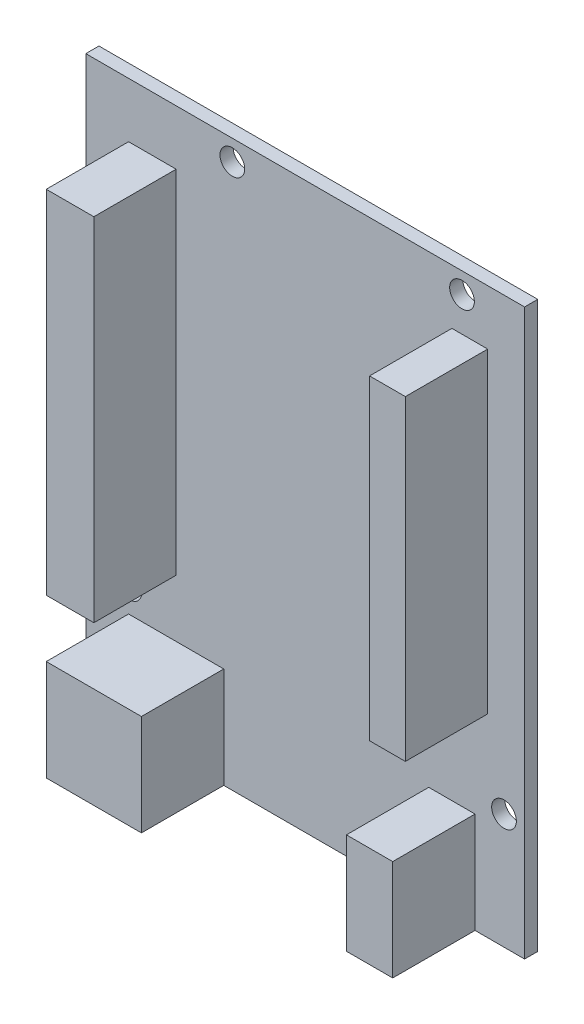
ISO-10303-21;
HEADER;
FILE_DESCRIPTION(('STEP AP214'),'2;1');
FILE_NAME('part.step','',(''),(''),'','','');
FILE_SCHEMA(('AUTOMOTIVE_DESIGN { 1 0 10303 214 1 1 1 1 }'));
ENDSEC;
DATA;
#1=APPLICATION_CONTEXT('core data for automotive mechanical design processes');
#2=APPLICATION_PROTOCOL_DEFINITION('international standard','automotive_design',2000,#1);
#3=PRODUCT_CONTEXT('',#1,'mechanical');
#4=PRODUCT('Part','Part','',(#3));
#5=PRODUCT_RELATED_PRODUCT_CATEGORY('part','',(#4));
#6=PRODUCT_DEFINITION_FORMATION('','',#4);
#7=PRODUCT_DEFINITION_CONTEXT('part definition',#1,'design');
#8=PRODUCT_DEFINITION('design','',#6,#7);
#9=PRODUCT_DEFINITION_SHAPE('','',#8);
#10=(LENGTH_UNIT() NAMED_UNIT(*) SI_UNIT(.MILLI.,.METRE.));
#11=(NAMED_UNIT(*) PLANE_ANGLE_UNIT() SI_UNIT($,.RADIAN.));
#12=(NAMED_UNIT(*) SI_UNIT($,.STERADIAN.) SOLID_ANGLE_UNIT());
#13=UNCERTAINTY_MEASURE_WITH_UNIT(LENGTH_MEASURE(1.E-05),#10,'distance_accuracy_value','');
#14=(GEOMETRIC_REPRESENTATION_CONTEXT(3) GLOBAL_UNCERTAINTY_ASSIGNED_CONTEXT((#13)) GLOBAL_UNIT_ASSIGNED_CONTEXT((#10,
#11,#12)) REPRESENTATION_CONTEXT('',''));
#15=CARTESIAN_POINT('',(0.,0.,0.));
#16=DIRECTION('',(0.,0.,1.));
#17=DIRECTION('',(1.,0.,0.));
#18=AXIS2_PLACEMENT_3D('',#15,#16,#17);
#19=CARTESIAN_POINT('',(0.,0.,1.6));
#20=DIRECTION('',(0.,0.,1.));
#21=DIRECTION('',(1.,0.,0.));
#22=AXIS2_PLACEMENT_3D('',#19,#20,#21);
#23=PLANE('',#22);
#24=CARTESIAN_POINT('',(-32.490811044057,0.148070951768275,1.6));
#25=DIRECTION('',(0.,0.,1.));
#26=DIRECTION('',(1.,0.,0.));
#27=AXIS2_PLACEMENT_3D('',#24,#25,#26);
#28=CIRCLE('',#27,1.5);
#29=CARTESIAN_POINT('',(-30.990811044057,0.148070951768275,1.6));
#30=VERTEX_POINT('',#29);
#31=EDGE_CURVE('E295',#30,#30,#28,.T.);
#32=ORIENTED_EDGE('',*,*,#31,.F.);
#33=EDGE_LOOP('',(#32));
#34=FACE_BOUND('',#33,.T.);
#35=CARTESIAN_POINT('',(-19.990811044057,50.9480709517683,1.6));
#36=DIRECTION('',(0.,0.,1.));
#37=DIRECTION('',(1.,0.,0.));
#38=AXIS2_PLACEMENT_3D('',#35,#36,#37);
#39=CIRCLE('',#38,1.5);
#40=CARTESIAN_POINT('',(-18.490811044057,50.9480709517683,1.6));
#41=VERTEX_POINT('',#40);
#42=EDGE_CURVE('E307',#41,#41,#39,.T.);
#43=ORIENTED_EDGE('',*,*,#42,.F.);
#44=EDGE_LOOP('',(#43));
#45=FACE_BOUND('',#44,.T.);
#46=CARTESIAN_POINT('',(7.909188955943,50.9480709517683,1.6));
#47=DIRECTION('',(0.,0.,1.));
#48=DIRECTION('',(1.,0.,0.));
#49=AXIS2_PLACEMENT_3D('',#46,#47,#48);
#50=CIRCLE('',#49,1.5);
#51=CARTESIAN_POINT('',(9.409188955943,50.9480709517683,1.6));
#52=VERTEX_POINT('',#51);
#53=EDGE_CURVE('E301',#52,#52,#50,.T.);
#54=ORIENTED_EDGE('',*,*,#53,.F.);
#55=EDGE_LOOP('',(#54));
#56=FACE_BOUND('',#55,.T.);
#57=CARTESIAN_POINT('',(13.009188955943,-1.15192904823173,1.6));
#58=DIRECTION('',(0.,0.,1.));
#59=DIRECTION('',(1.,0.,0.));
#60=AXIS2_PLACEMENT_3D('',#57,#58,#59);
#61=CIRCLE('',#60,1.5);
#62=CARTESIAN_POINT('',(14.509188955943,-1.15192904823173,1.6));
#63=VERTEX_POINT('',#62);
#64=EDGE_CURVE('E289',#63,#63,#61,.T.);
#65=ORIENTED_EDGE('',*,*,#64,.F.);
#66=EDGE_LOOP('',(#65));
#67=FACE_BOUND('',#66,.T.);
#68=DIRECTION('',(1.,0.,0.));
#69=VECTOR('',#68,1.);
#70=CARTESIAN_POINT('',(-37.790811044057,-15.1519290482317,1.6));
#71=LINE('',#70,#69);
#72=CARTESIAN_POINT('',(-21.0309524207311,-15.1519290482317,1.6));
#73=VERTEX_POINT('',#72);
#74=CARTESIAN_POINT('',(3.87000094801704,-15.1519290482317,1.6));
#75=VERTEX_POINT('',#74);
#76=EDGE_CURVE('E321',#73,#75,#71,.T.);
#77=ORIENTED_EDGE('',*,*,#76,.T.);
#78=DIRECTION('',(0.,-1.,0.));
#79=VECTOR('',#78,1.);
#80=CARTESIAN_POINT('',(3.87000094801704,-15.1519290482317,1.6));
#81=LINE('',#80,#79);
#82=CARTESIAN_POINT('',(3.87000094801704,-2.9036424826252,1.6));
#83=VERTEX_POINT('',#82);
#84=EDGE_CURVE('E228',#83,#75,#81,.T.);
#85=ORIENTED_EDGE('',*,*,#84,.F.);
#86=DIRECTION('',(-1.,0.,0.));
#87=VECTOR('',#86,1.);
#88=CARTESIAN_POINT('',(3.87000094801704,-2.9036424826252,1.6));
#89=LINE('',#88,#87);
#90=CARTESIAN_POINT('',(9.49220023315744,-2.9036424826252,1.6));
#91=VERTEX_POINT('',#90);
#92=EDGE_CURVE('E233',#91,#83,#89,.T.);
#93=ORIENTED_EDGE('',*,*,#92,.F.);
#94=DIRECTION('',(0.,1.,0.));
#95=VECTOR('',#94,1.);
#96=CARTESIAN_POINT('',(9.49220023315744,-15.1519290482317,1.6));
#97=LINE('',#96,#95);
#98=CARTESIAN_POINT('',(9.49220023315744,-15.1519290482317,1.6));
#99=VERTEX_POINT('',#98);
#100=EDGE_CURVE('E242',#99,#91,#97,.T.);
#101=ORIENTED_EDGE('',*,*,#100,.F.);
#102=CARTESIAN_POINT('',(15.509188955943,-15.1519290482317,1.6));
#103=VERTEX_POINT('',#102);
#104=EDGE_CURVE('E316',#99,#103,#71,.T.);
#105=ORIENTED_EDGE('',*,*,#104,.T.);
#106=DIRECTION('',(0.,1.,0.));
#107=VECTOR('',#106,1.);
#108=CARTESIAN_POINT('',(15.509188955943,53.4480709517683,1.6));
#109=LINE('',#108,#107);
#110=CARTESIAN_POINT('',(15.509188955943,53.4480709517683,1.6));
#111=VERTEX_POINT('',#110);
#112=EDGE_CURVE('E320',#103,#111,#109,.T.);
#113=ORIENTED_EDGE('',*,*,#112,.T.);
#114=DIRECTION('',(-1.,0.,0.));
#115=VECTOR('',#114,1.);
#116=CARTESIAN_POINT('',(-37.790811044057,53.4480709517683,1.6));
#117=LINE('',#116,#115);
#118=CARTESIAN_POINT('',(-37.790811044057,53.4480709517683,1.6));
#119=VERTEX_POINT('',#118);
#120=EDGE_CURVE('E323',#111,#119,#117,.T.);
#121=ORIENTED_EDGE('',*,*,#120,.T.);
#122=DIRECTION('',(0.,-1.,0.));
#123=VECTOR('',#122,1.);
#124=CARTESIAN_POINT('',(-37.790811044057,53.4480709517683,1.6));
#125=LINE('',#124,#123);
#126=CARTESIAN_POINT('',(-37.790811044057,-15.1519290482317,1.6));
#127=VERTEX_POINT('',#126);
#128=EDGE_CURVE('E313',#119,#127,#125,.T.);
#129=ORIENTED_EDGE('',*,*,#128,.T.);
#130=CARTESIAN_POINT('',(-32.5922076167509,-15.1519290482317,1.6));
#131=VERTEX_POINT('',#130);
#132=EDGE_CURVE('E318',#127,#131,#71,.T.);
#133=ORIENTED_EDGE('',*,*,#132,.T.);
#134=DIRECTION('',(0.,-1.,0.));
#135=VECTOR('',#134,1.);
#136=CARTESIAN_POINT('',(-32.5922076167509,-15.1519290482317,1.6));
#137=LINE('',#136,#135);
#138=CARTESIAN_POINT('',(-32.5922076167509,-2.9036424826252,1.6));
#139=VERTEX_POINT('',#138);
#140=EDGE_CURVE('E258',#139,#131,#137,.T.);
#141=ORIENTED_EDGE('',*,*,#140,.F.);
#142=DIRECTION('',(-1.,0.,0.));
#143=VECTOR('',#142,1.);
#144=CARTESIAN_POINT('',(-32.5922076167509,-2.9036424826252,1.6));
#145=LINE('',#144,#143);
#146=CARTESIAN_POINT('',(-21.0309524207311,-2.9036424826252,1.6));
#147=VERTEX_POINT('',#146);
#148=EDGE_CURVE('E263',#147,#139,#145,.T.);
#149=ORIENTED_EDGE('',*,*,#148,.F.);
#150=DIRECTION('',(0.,1.,0.));
#151=VECTOR('',#150,1.);
#152=CARTESIAN_POINT('',(-21.0309524207311,-15.1519290482317,1.6));
#153=LINE('',#152,#151);
#154=EDGE_CURVE('E272',#73,#147,#153,.T.);
#155=ORIENTED_EDGE('',*,*,#154,.F.);
#156=EDGE_LOOP('',(#77,#85,#93,#101,#105,#113,#121,#129,#133,#141,#149,#155));
#157=FACE_BOUND('',#156,.T.);
#158=DIRECTION('',(1.,0.,0.));
#159=VECTOR('',#158,1.);
#160=CARTESIAN_POINT('',(-32.5922076167509,4.06765152578359,1.6));
#161=LINE('',#160,#159);
#162=CARTESIAN_POINT('',(-32.5922076167509,4.06765152578359,1.6));
#163=VERTEX_POINT('',#162);
#164=CARTESIAN_POINT('',(-26.811580018741,4.06765152578359,1.6));
#165=VERTEX_POINT('',#164);
#166=EDGE_CURVE('E200',#163,#165,#161,.T.);
#167=ORIENTED_EDGE('',*,*,#166,.F.);
#168=DIRECTION('',(0.,-1.,0.));
#169=VECTOR('',#168,1.);
#170=CARTESIAN_POINT('',(-32.5922076167509,46.7786391776741,1.6));
#171=LINE('',#170,#169);
#172=CARTESIAN_POINT('',(-32.5922076167509,46.7786391776741,1.6));
#173=VERTEX_POINT('',#172);
#174=EDGE_CURVE('E197',#173,#163,#171,.T.);
#175=ORIENTED_EDGE('',*,*,#174,.F.);
#176=DIRECTION('',(-1.,0.,0.));
#177=VECTOR('',#176,1.);
#178=CARTESIAN_POINT('',(-32.5922076167509,46.7786391776741,1.6));
#179=LINE('',#178,#177);
#180=CARTESIAN_POINT('',(-26.811580018741,46.7786391776741,1.6));
#181=VERTEX_POINT('',#180);
#182=EDGE_CURVE('E209',#181,#173,#179,.T.);
#183=ORIENTED_EDGE('',*,*,#182,.F.);
#184=DIRECTION('',(0.,1.,0.));
#185=VECTOR('',#184,1.);
#186=CARTESIAN_POINT('',(-26.811580018741,46.7786391776741,1.6));
#187=LINE('',#186,#185);
#188=EDGE_CURVE('E217',#165,#181,#187,.T.);
#189=ORIENTED_EDGE('',*,*,#188,.F.);
#190=EDGE_LOOP('',(#167,#175,#183,#189));
#191=FACE_BOUND('',#190,.T.);
#192=DIRECTION('',(1.,0.,0.));
#193=VECTOR('',#192,1.);
#194=CARTESIAN_POINT('',(6.68110059058724,8.39841275371711,1.6));
#195=LINE('',#194,#193);
#196=CARTESIAN_POINT('',(6.68110059058724,8.39841275371711,1.6));
#197=VERTEX_POINT('',#196);
#198=CARTESIAN_POINT('',(11.02922519998,8.39841275371711,1.6));
#199=VERTEX_POINT('',#198);
#200=EDGE_CURVE('E638',#197,#199,#195,.T.);
#201=ORIENTED_EDGE('',*,*,#200,.F.);
#202=DIRECTION('',(0.,-1.,0.));
#203=VECTOR('',#202,1.);
#204=CARTESIAN_POINT('',(6.68110059058724,46.7786391776741,1.6));
#205=LINE('',#204,#203);
#206=CARTESIAN_POINT('',(6.68110059058724,46.7786391776741,1.6));
#207=VERTEX_POINT('',#206);
#208=EDGE_CURVE('E195',#207,#197,#205,.T.);
#209=ORIENTED_EDGE('',*,*,#208,.F.);
#210=DIRECTION('',(-1.,0.,0.));
#211=VECTOR('',#210,1.);
#212=CARTESIAN_POINT('',(6.68110059058724,46.7786391776741,1.6));
#213=LINE('',#212,#211);
#214=CARTESIAN_POINT('',(11.02922519998,46.7786391776741,1.6));
#215=VERTEX_POINT('',#214);
#216=EDGE_CURVE('E191',#215,#207,#213,.T.);
#217=ORIENTED_EDGE('',*,*,#216,.F.);
#218=DIRECTION('',(0.,1.,0.));
#219=VECTOR('',#218,1.);
#220=CARTESIAN_POINT('',(11.02922519998,46.7786391776741,1.6));
#221=LINE('',#220,#219);
#222=EDGE_CURVE('E635',#199,#215,#221,.T.);
#223=ORIENTED_EDGE('',*,*,#222,.F.);
#224=EDGE_LOOP('',(#201,#209,#217,#223));
#225=FACE_BOUND('',#224,.T.);
#226=ADVANCED_FACE('F34',(#34,#45,#56,#67,#157,#191,#225),#23,.T.);
#227=CARTESIAN_POINT('',(0.,0.,0.));
#228=DIRECTION('',(0.,0.,1.));
#229=DIRECTION('',(1.,0.,0.));
#230=AXIS2_PLACEMENT_3D('',#227,#228,#229);
#231=PLANE('',#230);
#232=DIRECTION('',(0.,-1.,0.));
#233=VECTOR('',#232,1.);
#234=CARTESIAN_POINT('',(-37.790811044057,53.4480709517683,0.));
#235=LINE('',#234,#233);
#236=CARTESIAN_POINT('',(-37.790811044057,53.4480709517683,0.));
#237=VERTEX_POINT('',#236);
#238=CARTESIAN_POINT('',(-37.790811044057,-15.1519290482317,0.));
#239=VERTEX_POINT('',#238);
#240=EDGE_CURVE('E310',#237,#239,#235,.T.);
#241=ORIENTED_EDGE('',*,*,#240,.F.);
#242=DIRECTION('',(-1.,0.,0.));
#243=VECTOR('',#242,1.);
#244=CARTESIAN_POINT('',(-37.790811044057,53.4480709517683,0.));
#245=LINE('',#244,#243);
#246=CARTESIAN_POINT('',(15.509188955943,53.4480709517683,0.));
#247=VERTEX_POINT('',#246);
#248=EDGE_CURVE('E317',#247,#237,#245,.T.);
#249=ORIENTED_EDGE('',*,*,#248,.F.);
#250=DIRECTION('',(0.,1.,0.));
#251=VECTOR('',#250,1.);
#252=CARTESIAN_POINT('',(15.509188955943,53.4480709517683,0.));
#253=LINE('',#252,#251);
#254=CARTESIAN_POINT('',(15.509188955943,-15.1519290482317,0.));
#255=VERTEX_POINT('',#254);
#256=EDGE_CURVE('E330',#255,#247,#253,.T.);
#257=ORIENTED_EDGE('',*,*,#256,.F.);
#258=DIRECTION('',(1.,0.,0.));
#259=VECTOR('',#258,1.);
#260=CARTESIAN_POINT('',(-37.790811044057,-15.1519290482317,0.));
#261=LINE('',#260,#259);
#262=EDGE_CURVE('E328',#239,#255,#261,.T.);
#263=ORIENTED_EDGE('',*,*,#262,.F.);
#264=EDGE_LOOP('',(#241,#249,#257,#263));
#265=FACE_BOUND('',#264,.T.);
#266=CARTESIAN_POINT('',(-19.990811044057,50.9480709517683,0.));
#267=DIRECTION('',(0.,0.,1.));
#268=DIRECTION('',(1.,0.,0.));
#269=AXIS2_PLACEMENT_3D('',#266,#267,#268);
#270=CIRCLE('',#269,1.5);
#271=CARTESIAN_POINT('',(-18.490811044057,50.9480709517683,0.));
#272=VERTEX_POINT('',#271);
#273=EDGE_CURVE('E304',#272,#272,#270,.T.);
#274=ORIENTED_EDGE('',*,*,#273,.T.);
#275=EDGE_LOOP('',(#274));
#276=FACE_BOUND('',#275,.T.);
#277=CARTESIAN_POINT('',(7.909188955943,50.9480709517683,0.));
#278=DIRECTION('',(0.,0.,1.));
#279=DIRECTION('',(1.,0.,0.));
#280=AXIS2_PLACEMENT_3D('',#277,#278,#279);
#281=CIRCLE('',#280,1.5);
#282=CARTESIAN_POINT('',(9.409188955943,50.9480709517683,0.));
#283=VERTEX_POINT('',#282);
#284=EDGE_CURVE('E298',#283,#283,#281,.T.);
#285=ORIENTED_EDGE('',*,*,#284,.T.);
#286=EDGE_LOOP('',(#285));
#287=FACE_BOUND('',#286,.T.);
#288=CARTESIAN_POINT('',(-32.490811044057,0.148070951768275,0.));
#289=DIRECTION('',(0.,0.,1.));
#290=DIRECTION('',(1.,0.,0.));
#291=AXIS2_PLACEMENT_3D('',#288,#289,#290);
#292=CIRCLE('',#291,1.5);
#293=CARTESIAN_POINT('',(-30.990811044057,0.148070951768275,0.));
#294=VERTEX_POINT('',#293);
#295=EDGE_CURVE('E292',#294,#294,#292,.T.);
#296=ORIENTED_EDGE('',*,*,#295,.T.);
#297=EDGE_LOOP('',(#296));
#298=FACE_BOUND('',#297,.T.);
#299=CARTESIAN_POINT('',(13.009188955943,-1.15192904823173,0.));
#300=DIRECTION('',(0.,0.,1.));
#301=DIRECTION('',(1.,0.,0.));
#302=AXIS2_PLACEMENT_3D('',#299,#300,#301);
#303=CIRCLE('',#302,1.5);
#304=CARTESIAN_POINT('',(14.509188955943,-1.15192904823173,0.));
#305=VERTEX_POINT('',#304);
#306=EDGE_CURVE('E288',#305,#305,#303,.T.);
#307=ORIENTED_EDGE('',*,*,#306,.T.);
#308=EDGE_LOOP('',(#307));
#309=FACE_BOUND('',#308,.T.);
#310=ADVANCED_FACE('F348',(#265,#276,#287,#298,#309),#231,.F.);
#311=CARTESIAN_POINT('',(-37.790811044057,53.4480709517683,1.6));
#312=DIRECTION('',(1.,0.,0.));
#313=DIRECTION('',(0.,1.,0.));
#314=AXIS2_PLACEMENT_3D('',#311,#312,#313);
#315=PLANE('',#314);
#316=ORIENTED_EDGE('',*,*,#240,.T.);
#317=DIRECTION('',(0.,0.,-1.));
#318=VECTOR('',#317,1.);
#319=CARTESIAN_POINT('',(-37.790811044057,-15.1519290482317,1.6));
#320=LINE('',#319,#318);
#321=EDGE_CURVE('E11',#127,#239,#320,.T.);
#322=ORIENTED_EDGE('',*,*,#321,.F.);
#323=ORIENTED_EDGE('',*,*,#128,.F.);
#324=DIRECTION('',(0.,0.,-1.));
#325=VECTOR('',#324,1.);
#326=CARTESIAN_POINT('',(-37.790811044057,53.4480709517683,1.6));
#327=LINE('',#326,#325);
#328=EDGE_CURVE('E325',#119,#237,#327,.T.);
#329=ORIENTED_EDGE('',*,*,#328,.T.);
#330=EDGE_LOOP('',(#316,#322,#323,#329));
#331=FACE_BOUND('',#330,.T.);
#332=ADVANCED_FACE('F36',(#331),#315,.F.);
#333=CARTESIAN_POINT('',(-37.790811044057,-15.1519290482317,1.6));
#334=DIRECTION('',(0.,1.,0.));
#335=DIRECTION('',(0.,0.,1.));
#336=AXIS2_PLACEMENT_3D('',#333,#334,#335);
#337=PLANE('',#336);
#338=ORIENTED_EDGE('',*,*,#262,.T.);
#339=DIRECTION('',(0.,0.,-1.));
#340=VECTOR('',#339,1.);
#341=CARTESIAN_POINT('',(15.509188955943,-15.1519290482317,1.6));
#342=LINE('',#341,#340);
#343=EDGE_CURVE('E42',#103,#255,#342,.T.);
#344=ORIENTED_EDGE('',*,*,#343,.F.);
#345=ORIENTED_EDGE('',*,*,#104,.F.);
#346=DIRECTION('',(0.,0.,-1.));
#347=VECTOR('',#346,1.);
#348=CARTESIAN_POINT('',(9.49220023315744,-15.1519290482317,11.6));
#349=LINE('',#348,#347);
#350=CARTESIAN_POINT('',(9.49220023315744,-15.1519290482317,11.6));
#351=VERTEX_POINT('',#350);
#352=EDGE_CURVE('E252',#351,#99,#349,.T.);
#353=ORIENTED_EDGE('',*,*,#352,.F.);
#354=DIRECTION('',(1.,0.,0.));
#355=VECTOR('',#354,1.);
#356=CARTESIAN_POINT('',(3.87000094801704,-15.1519290482317,11.6));
#357=LINE('',#356,#355);
#358=CARTESIAN_POINT('',(3.87000094801704,-15.1519290482317,11.6));
#359=VERTEX_POINT('',#358);
#360=EDGE_CURVE('E232',#359,#351,#357,.T.);
#361=ORIENTED_EDGE('',*,*,#360,.F.);
#362=DIRECTION('',(0.,0.,-1.));
#363=VECTOR('',#362,1.);
#364=CARTESIAN_POINT('',(3.87000094801704,-15.1519290482317,11.6));
#365=LINE('',#364,#363);
#366=EDGE_CURVE('E255',#359,#75,#365,.T.);
#367=ORIENTED_EDGE('',*,*,#366,.T.);
#368=ORIENTED_EDGE('',*,*,#76,.F.);
#369=DIRECTION('',(0.,0.,-1.));
#370=VECTOR('',#369,1.);
#371=CARTESIAN_POINT('',(-21.0309524207311,-15.1519290482317,11.6));
#372=LINE('',#371,#370);
#373=CARTESIAN_POINT('',(-21.0309524207311,-15.1519290482317,11.6));
#374=VERTEX_POINT('',#373);
#375=EDGE_CURVE('E282',#374,#73,#372,.T.);
#376=ORIENTED_EDGE('',*,*,#375,.F.);
#377=DIRECTION('',(1.,0.,0.));
#378=VECTOR('',#377,1.);
#379=CARTESIAN_POINT('',(-32.5922076167509,-15.1519290482317,11.6));
#380=LINE('',#379,#378);
#381=CARTESIAN_POINT('',(-32.5922076167509,-15.1519290482317,11.6));
#382=VERTEX_POINT('',#381);
#383=EDGE_CURVE('E262',#382,#374,#380,.T.);
#384=ORIENTED_EDGE('',*,*,#383,.F.);
#385=DIRECTION('',(0.,0.,-1.));
#386=VECTOR('',#385,1.);
#387=CARTESIAN_POINT('',(-32.5922076167509,-15.1519290482317,11.6));
#388=LINE('',#387,#386);
#389=EDGE_CURVE('E285',#382,#131,#388,.T.);
#390=ORIENTED_EDGE('',*,*,#389,.T.);
#391=ORIENTED_EDGE('',*,*,#132,.F.);
#392=ORIENTED_EDGE('',*,*,#321,.T.);
#393=EDGE_LOOP('',(#338,#344,#345,#353,#361,#367,#368,#376,#384,#390,#391,#392));
#394=FACE_BOUND('',#393,.T.);
#395=ADVANCED_FACE('F364',(#394),#337,.F.);
#396=CARTESIAN_POINT('',(15.509188955943,53.4480709517683,1.6));
#397=DIRECTION('',(-1.,0.,0.));
#398=DIRECTION('',(0.,-1.,0.));
#399=AXIS2_PLACEMENT_3D('',#396,#397,#398);
#400=PLANE('',#399);
#401=ORIENTED_EDGE('',*,*,#256,.T.);
#402=DIRECTION('',(0.,0.,-1.));
#403=VECTOR('',#402,1.);
#404=CARTESIAN_POINT('',(15.509188955943,53.4480709517683,1.6));
#405=LINE('',#404,#403);
#406=EDGE_CURVE('E335',#111,#247,#405,.T.);
#407=ORIENTED_EDGE('',*,*,#406,.F.);
#408=ORIENTED_EDGE('',*,*,#112,.F.);
#409=ORIENTED_EDGE('',*,*,#343,.T.);
#410=EDGE_LOOP('',(#401,#407,#408,#409));
#411=FACE_BOUND('',#410,.T.);
#412=ADVANCED_FACE('F342',(#411),#400,.F.);
#413=CARTESIAN_POINT('',(-37.790811044057,53.4480709517683,1.6));
#414=DIRECTION('',(0.,-1.,0.));
#415=DIRECTION('',(0.,0.,-1.));
#416=AXIS2_PLACEMENT_3D('',#413,#414,#415);
#417=PLANE('',#416);
#418=ORIENTED_EDGE('',*,*,#248,.T.);
#419=ORIENTED_EDGE('',*,*,#328,.F.);
#420=ORIENTED_EDGE('',*,*,#120,.F.);
#421=ORIENTED_EDGE('',*,*,#406,.T.);
#422=EDGE_LOOP('',(#418,#419,#420,#421));
#423=FACE_BOUND('',#422,.T.);
#424=ADVANCED_FACE('F352',(#423),#417,.F.);
#425=CARTESIAN_POINT('',(-19.990811044057,50.9480709517683,1.6));
#426=DIRECTION('',(0.,0.,-1.));
#427=DIRECTION('',(-1.,0.,0.));
#428=AXIS2_PLACEMENT_3D('',#425,#426,#427);
#429=CYLINDRICAL_SURFACE('',#428,1.5);
#430=ORIENTED_EDGE('',*,*,#42,.T.);
#431=EDGE_LOOP('',(#430));
#432=FACE_BOUND('',#431,.T.);
#433=ORIENTED_EDGE('',*,*,#273,.F.);
#434=EDGE_LOOP('',(#433));
#435=FACE_BOUND('',#434,.T.);
#436=ADVANCED_FACE('F399',(#432,#435),#429,.F.);
#437=CARTESIAN_POINT('',(7.909188955943,50.9480709517683,1.6));
#438=DIRECTION('',(0.,0.,-1.));
#439=DIRECTION('',(-1.,0.,0.));
#440=AXIS2_PLACEMENT_3D('',#437,#438,#439);
#441=CYLINDRICAL_SURFACE('',#440,1.5);
#442=ORIENTED_EDGE('',*,*,#53,.T.);
#443=EDGE_LOOP('',(#442));
#444=FACE_BOUND('',#443,.T.);
#445=ORIENTED_EDGE('',*,*,#284,.F.);
#446=EDGE_LOOP('',(#445));
#447=FACE_BOUND('',#446,.T.);
#448=ADVANCED_FACE('F445',(#444,#447),#441,.F.);
#449=CARTESIAN_POINT('',(-32.490811044057,0.148070951768275,1.6));
#450=DIRECTION('',(0.,0.,-1.));
#451=DIRECTION('',(-1.,0.,0.));
#452=AXIS2_PLACEMENT_3D('',#449,#450,#451);
#453=CYLINDRICAL_SURFACE('',#452,1.5);
#454=ORIENTED_EDGE('',*,*,#31,.T.);
#455=EDGE_LOOP('',(#454));
#456=FACE_BOUND('',#455,.T.);
#457=ORIENTED_EDGE('',*,*,#295,.F.);
#458=EDGE_LOOP('',(#457));
#459=FACE_BOUND('',#458,.T.);
#460=ADVANCED_FACE('F453',(#456,#459),#453,.F.);
#461=CARTESIAN_POINT('',(13.009188955943,-1.15192904823173,1.6));
#462=DIRECTION('',(0.,0.,-1.));
#463=DIRECTION('',(-1.,0.,0.));
#464=AXIS2_PLACEMENT_3D('',#461,#462,#463);
#465=CYLINDRICAL_SURFACE('',#464,1.5);
#466=ORIENTED_EDGE('',*,*,#64,.T.);
#467=EDGE_LOOP('',(#466));
#468=FACE_BOUND('',#467,.T.);
#469=ORIENTED_EDGE('',*,*,#306,.F.);
#470=EDGE_LOOP('',(#469));
#471=FACE_BOUND('',#470,.T.);
#472=ADVANCED_FACE('F461',(#468,#471),#465,.F.);
#473=CARTESIAN_POINT('',(-32.5922076167509,-15.1519290482317,11.6));
#474=DIRECTION('',(1.,0.,0.));
#475=DIRECTION('',(0.,0.,-1.));
#476=AXIS2_PLACEMENT_3D('',#473,#474,#475);
#477=PLANE('',#476);
#478=ORIENTED_EDGE('',*,*,#140,.T.);
#479=ORIENTED_EDGE('',*,*,#389,.F.);
#480=DIRECTION('',(0.,-1.,0.));
#481=VECTOR('',#480,1.);
#482=CARTESIAN_POINT('',(-32.5922076167509,-15.1519290482317,11.6));
#483=LINE('',#482,#481);
#484=CARTESIAN_POINT('',(-32.5922076167509,-2.9036424826252,11.6));
#485=VERTEX_POINT('',#484);
#486=EDGE_CURVE('E259',#485,#382,#483,.T.);
#487=ORIENTED_EDGE('',*,*,#486,.F.);
#488=DIRECTION('',(0.,0.,-1.));
#489=VECTOR('',#488,1.);
#490=CARTESIAN_POINT('',(-32.5922076167509,-2.9036424826252,11.6));
#491=LINE('',#490,#489);
#492=EDGE_CURVE('E269',#485,#139,#491,.T.);
#493=ORIENTED_EDGE('',*,*,#492,.T.);
#494=EDGE_LOOP('',(#478,#479,#487,#493));
#495=FACE_BOUND('',#494,.T.);
#496=ADVANCED_FACE('F469',(#495),#477,.F.);
#497=CARTESIAN_POINT('',(-21.0309524207311,-15.1519290482317,11.6));
#498=DIRECTION('',(-1.,0.,0.));
#499=DIRECTION('',(0.,0.,1.));
#500=AXIS2_PLACEMENT_3D('',#497,#498,#499);
#501=PLANE('',#500);
#502=ORIENTED_EDGE('',*,*,#154,.T.);
#503=DIRECTION('',(0.,0.,-1.));
#504=VECTOR('',#503,1.);
#505=CARTESIAN_POINT('',(-21.0309524207311,-2.9036424826252,11.6));
#506=LINE('',#505,#504);
#507=CARTESIAN_POINT('',(-21.0309524207311,-2.9036424826252,11.6));
#508=VERTEX_POINT('',#507);
#509=EDGE_CURVE('E279',#508,#147,#506,.T.);
#510=ORIENTED_EDGE('',*,*,#509,.F.);
#511=DIRECTION('',(0.,1.,0.));
#512=VECTOR('',#511,1.);
#513=CARTESIAN_POINT('',(-21.0309524207311,-15.1519290482317,11.6));
#514=LINE('',#513,#512);
#515=EDGE_CURVE('E265',#374,#508,#514,.T.);
#516=ORIENTED_EDGE('',*,*,#515,.F.);
#517=ORIENTED_EDGE('',*,*,#375,.T.);
#518=EDGE_LOOP('',(#502,#510,#516,#517));
#519=FACE_BOUND('',#518,.T.);
#520=ADVANCED_FACE('F484',(#519),#501,.F.);
#521=CARTESIAN_POINT('',(-32.5922076167509,-2.9036424826252,11.6));
#522=DIRECTION('',(0.,-1.,0.));
#523=DIRECTION('',(0.,0.,-1.));
#524=AXIS2_PLACEMENT_3D('',#521,#522,#523);
#525=PLANE('',#524);
#526=ORIENTED_EDGE('',*,*,#148,.T.);
#527=ORIENTED_EDGE('',*,*,#492,.F.);
#528=DIRECTION('',(-1.,0.,0.));
#529=VECTOR('',#528,1.);
#530=CARTESIAN_POINT('',(-32.5922076167509,-2.9036424826252,11.6));
#531=LINE('',#530,#529);
#532=EDGE_CURVE('E267',#508,#485,#531,.T.);
#533=ORIENTED_EDGE('',*,*,#532,.F.);
#534=ORIENTED_EDGE('',*,*,#509,.T.);
#535=EDGE_LOOP('',(#526,#527,#533,#534));
#536=FACE_BOUND('',#535,.T.);
#537=ADVANCED_FACE('F494',(#536),#525,.F.);
#538=CARTESIAN_POINT('',(0.,0.,11.6));
#539=DIRECTION('',(0.,0.,-1.));
#540=DIRECTION('',(-1.,0.,0.));
#541=AXIS2_PLACEMENT_3D('',#538,#539,#540);
#542=PLANE('',#541);
#543=ORIENTED_EDGE('',*,*,#486,.T.);
#544=ORIENTED_EDGE('',*,*,#383,.T.);
#545=ORIENTED_EDGE('',*,*,#515,.T.);
#546=ORIENTED_EDGE('',*,*,#532,.T.);
#547=EDGE_LOOP('',(#543,#544,#545,#546));
#548=FACE_BOUND('',#547,.T.);
#549=ADVANCED_FACE('F504',(#548),#542,.F.);
#550=CARTESIAN_POINT('',(3.87000094801704,-15.1519290482317,11.6));
#551=DIRECTION('',(1.,0.,0.));
#552=DIRECTION('',(0.,0.,-1.));
#553=AXIS2_PLACEMENT_3D('',#550,#551,#552);
#554=PLANE('',#553);
#555=ORIENTED_EDGE('',*,*,#84,.T.);
#556=ORIENTED_EDGE('',*,*,#366,.F.);
#557=DIRECTION('',(0.,-1.,0.));
#558=VECTOR('',#557,1.);
#559=CARTESIAN_POINT('',(3.87000094801704,-15.1519290482317,11.6));
#560=LINE('',#559,#558);
#561=CARTESIAN_POINT('',(3.87000094801704,-2.9036424826252,11.6));
#562=VERTEX_POINT('',#561);
#563=EDGE_CURVE('E229',#562,#359,#560,.T.);
#564=ORIENTED_EDGE('',*,*,#563,.F.);
#565=DIRECTION('',(0.,0.,-1.));
#566=VECTOR('',#565,1.);
#567=CARTESIAN_POINT('',(3.87000094801704,-2.9036424826252,11.6));
#568=LINE('',#567,#566);
#569=EDGE_CURVE('E239',#562,#83,#568,.T.);
#570=ORIENTED_EDGE('',*,*,#569,.T.);
#571=EDGE_LOOP('',(#555,#556,#564,#570));
#572=FACE_BOUND('',#571,.T.);
#573=ADVANCED_FACE('F367',(#572),#554,.F.);
#574=CARTESIAN_POINT('',(9.49220023315744,-15.1519290482317,11.6));
#575=DIRECTION('',(-1.,0.,0.));
#576=DIRECTION('',(0.,0.,1.));
#577=AXIS2_PLACEMENT_3D('',#574,#575,#576);
#578=PLANE('',#577);
#579=ORIENTED_EDGE('',*,*,#100,.T.);
#580=DIRECTION('',(0.,0.,-1.));
#581=VECTOR('',#580,1.);
#582=CARTESIAN_POINT('',(9.49220023315744,-2.9036424826252,11.6));
#583=LINE('',#582,#581);
#584=CARTESIAN_POINT('',(9.49220023315744,-2.9036424826252,11.6));
#585=VERTEX_POINT('',#584);
#586=EDGE_CURVE('E249',#585,#91,#583,.T.);
#587=ORIENTED_EDGE('',*,*,#586,.F.);
#588=DIRECTION('',(0.,1.,0.));
#589=VECTOR('',#588,1.);
#590=CARTESIAN_POINT('',(9.49220023315744,-15.1519290482317,11.6));
#591=LINE('',#590,#589);
#592=EDGE_CURVE('E235',#351,#585,#591,.T.);
#593=ORIENTED_EDGE('',*,*,#592,.F.);
#594=ORIENTED_EDGE('',*,*,#352,.T.);
#595=EDGE_LOOP('',(#579,#587,#593,#594));
#596=FACE_BOUND('',#595,.T.);
#597=ADVANCED_FACE('F374',(#596),#578,.F.);
#598=CARTESIAN_POINT('',(3.87000094801704,-2.9036424826252,11.6));
#599=DIRECTION('',(0.,-1.,0.));
#600=DIRECTION('',(0.,0.,-1.));
#601=AXIS2_PLACEMENT_3D('',#598,#599,#600);
#602=PLANE('',#601);
#603=ORIENTED_EDGE('',*,*,#92,.T.);
#604=ORIENTED_EDGE('',*,*,#569,.F.);
#605=DIRECTION('',(-1.,0.,0.));
#606=VECTOR('',#605,1.);
#607=CARTESIAN_POINT('',(3.87000094801704,-2.9036424826252,11.6));
#608=LINE('',#607,#606);
#609=EDGE_CURVE('E237',#585,#562,#608,.T.);
#610=ORIENTED_EDGE('',*,*,#609,.F.);
#611=ORIENTED_EDGE('',*,*,#586,.T.);
#612=EDGE_LOOP('',(#603,#604,#610,#611));
#613=FACE_BOUND('',#612,.T.);
#614=ADVANCED_FACE('F371',(#613),#602,.F.);
#615=CARTESIAN_POINT('',(0.,0.,11.6));
#616=DIRECTION('',(0.,0.,-1.));
#617=DIRECTION('',(-1.,0.,0.));
#618=AXIS2_PLACEMENT_3D('',#615,#616,#617);
#619=PLANE('',#618);
#620=ORIENTED_EDGE('',*,*,#563,.T.);
#621=ORIENTED_EDGE('',*,*,#360,.T.);
#622=ORIENTED_EDGE('',*,*,#592,.T.);
#623=ORIENTED_EDGE('',*,*,#609,.T.);
#624=EDGE_LOOP('',(#620,#621,#622,#623));
#625=FACE_BOUND('',#624,.T.);
#626=ADVANCED_FACE('F377',(#625),#619,.F.);
#627=CARTESIAN_POINT('',(-32.5922076167509,46.7786391776741,11.6));
#628=DIRECTION('',(1.,0.,0.));
#629=DIRECTION('',(0.,0.,-1.));
#630=AXIS2_PLACEMENT_3D('',#627,#628,#629);
#631=PLANE('',#630);
#632=ORIENTED_EDGE('',*,*,#174,.T.);
#633=DIRECTION('',(0.,0.,-1.));
#634=VECTOR('',#633,1.);
#635=CARTESIAN_POINT('',(-32.5922076167509,4.06765152578359,11.6));
#636=LINE('',#635,#634);
#637=CARTESIAN_POINT('',(-32.5922076167509,4.06765152578359,11.6));
#638=VERTEX_POINT('',#637);
#639=EDGE_CURVE('E226',#638,#163,#636,.T.);
#640=ORIENTED_EDGE('',*,*,#639,.F.);
#641=DIRECTION('',(0.,-1.,0.));
#642=VECTOR('',#641,1.);
#643=CARTESIAN_POINT('',(-32.5922076167509,46.7786391776741,11.6));
#644=LINE('',#643,#642);
#645=CARTESIAN_POINT('',(-32.5922076167509,46.7786391776741,11.6));
#646=VERTEX_POINT('',#645);
#647=EDGE_CURVE('E205',#646,#638,#644,.T.);
#648=ORIENTED_EDGE('',*,*,#647,.F.);
#649=DIRECTION('',(0.,0.,-1.));
#650=VECTOR('',#649,1.);
#651=CARTESIAN_POINT('',(-32.5922076167509,46.7786391776741,11.6));
#652=LINE('',#651,#650);
#653=EDGE_CURVE('E214',#646,#173,#652,.T.);
#654=ORIENTED_EDGE('',*,*,#653,.T.);
#655=EDGE_LOOP('',(#632,#640,#648,#654));
#656=FACE_BOUND('',#655,.T.);
#657=ADVANCED_FACE('F379',(#656),#631,.F.);
#658=CARTESIAN_POINT('',(-32.5922076167509,4.06765152578359,11.6));
#659=DIRECTION('',(0.,1.,0.));
#660=DIRECTION('',(0.,0.,1.));
#661=AXIS2_PLACEMENT_3D('',#658,#659,#660);
#662=PLANE('',#661);
#663=ORIENTED_EDGE('',*,*,#166,.T.);
#664=DIRECTION('',(0.,0.,-1.));
#665=VECTOR('',#664,1.);
#666=CARTESIAN_POINT('',(-26.811580018741,4.06765152578359,11.6));
#667=LINE('',#666,#665);
#668=CARTESIAN_POINT('',(-26.811580018741,4.06765152578359,11.6));
#669=VERTEX_POINT('',#668);
#670=EDGE_CURVE('E223',#669,#165,#667,.T.);
#671=ORIENTED_EDGE('',*,*,#670,.F.);
#672=DIRECTION('',(1.,0.,0.));
#673=VECTOR('',#672,1.);
#674=CARTESIAN_POINT('',(-32.5922076167509,4.06765152578359,11.6));
#675=LINE('',#674,#673);
#676=EDGE_CURVE('E208',#638,#669,#675,.T.);
#677=ORIENTED_EDGE('',*,*,#676,.F.);
#678=ORIENTED_EDGE('',*,*,#639,.T.);
#679=EDGE_LOOP('',(#663,#671,#677,#678));
#680=FACE_BOUND('',#679,.T.);
#681=ADVANCED_FACE('F385',(#680),#662,.F.);
#682=CARTESIAN_POINT('',(-26.811580018741,46.7786391776741,11.6));
#683=DIRECTION('',(-1.,0.,0.));
#684=DIRECTION('',(0.,0.,1.));
#685=AXIS2_PLACEMENT_3D('',#682,#683,#684);
#686=PLANE('',#685);
#687=ORIENTED_EDGE('',*,*,#188,.T.);
#688=DIRECTION('',(0.,0.,-1.));
#689=VECTOR('',#688,1.);
#690=CARTESIAN_POINT('',(-26.811580018741,46.7786391776741,11.6));
#691=LINE('',#690,#689);
#692=CARTESIAN_POINT('',(-26.811580018741,46.7786391776741,11.6));
#693=VERTEX_POINT('',#692);
#694=EDGE_CURVE('E57',#693,#181,#691,.T.);
#695=ORIENTED_EDGE('',*,*,#694,.F.);
#696=DIRECTION('',(0.,1.,0.));
#697=VECTOR('',#696,1.);
#698=CARTESIAN_POINT('',(-26.811580018741,46.7786391776741,11.6));
#699=LINE('',#698,#697);
#700=EDGE_CURVE('E211',#669,#693,#699,.T.);
#701=ORIENTED_EDGE('',*,*,#700,.F.);
#702=ORIENTED_EDGE('',*,*,#670,.T.);
#703=EDGE_LOOP('',(#687,#695,#701,#702));
#704=FACE_BOUND('',#703,.T.);
#705=ADVANCED_FACE('F555',(#704),#686,.F.);
#706=CARTESIAN_POINT('',(-32.5922076167509,46.7786391776741,11.6));
#707=DIRECTION('',(0.,-1.,0.));
#708=DIRECTION('',(0.,0.,-1.));
#709=AXIS2_PLACEMENT_3D('',#706,#707,#708);
#710=PLANE('',#709);
#711=ORIENTED_EDGE('',*,*,#182,.T.);
#712=ORIENTED_EDGE('',*,*,#653,.F.);
#713=DIRECTION('',(-1.,0.,0.));
#714=VECTOR('',#713,1.);
#715=CARTESIAN_POINT('',(-32.5922076167509,46.7786391776741,11.6));
#716=LINE('',#715,#714);
#717=EDGE_CURVE('E213',#693,#646,#716,.T.);
#718=ORIENTED_EDGE('',*,*,#717,.F.);
#719=ORIENTED_EDGE('',*,*,#694,.T.);
#720=EDGE_LOOP('',(#711,#712,#718,#719));
#721=FACE_BOUND('',#720,.T.);
#722=ADVANCED_FACE('F565',(#721),#710,.F.);
#723=CARTESIAN_POINT('',(0.,0.,11.6));
#724=DIRECTION('',(0.,0.,1.));
#725=DIRECTION('',(1.,0.,0.));
#726=AXIS2_PLACEMENT_3D('',#723,#724,#725);
#727=PLANE('',#726);
#728=ORIENTED_EDGE('',*,*,#647,.T.);
#729=ORIENTED_EDGE('',*,*,#676,.T.);
#730=ORIENTED_EDGE('',*,*,#700,.T.);
#731=ORIENTED_EDGE('',*,*,#717,.T.);
#732=EDGE_LOOP('',(#728,#729,#730,#731));
#733=FACE_BOUND('',#732,.T.);
#734=ADVANCED_FACE('F575',(#733),#727,.T.);
#735=CARTESIAN_POINT('',(6.68110059058724,46.7786391776741,11.6));
#736=DIRECTION('',(1.,0.,0.));
#737=DIRECTION('',(0.,0.,-1.));
#738=AXIS2_PLACEMENT_3D('',#735,#736,#737);
#739=PLANE('',#738);
#740=ORIENTED_EDGE('',*,*,#208,.T.);
#741=DIRECTION('',(0.,0.,-1.));
#742=VECTOR('',#741,1.);
#743=CARTESIAN_POINT('',(6.68110059058724,8.39841275371711,11.6));
#744=LINE('',#743,#742);
#745=CARTESIAN_POINT('',(6.68110059058724,8.39841275371711,11.6));
#746=VERTEX_POINT('',#745);
#747=EDGE_CURVE('E176',#746,#197,#744,.T.);
#748=ORIENTED_EDGE('',*,*,#747,.F.);
#749=DIRECTION('',(0.,-1.,0.));
#750=VECTOR('',#749,1.);
#751=CARTESIAN_POINT('',(6.68110059058724,46.7786391776741,11.6));
#752=LINE('',#751,#750);
#753=CARTESIAN_POINT('',(6.68110059058724,46.7786391776741,11.6));
#754=VERTEX_POINT('',#753);
#755=EDGE_CURVE('E183',#754,#746,#752,.T.);
#756=ORIENTED_EDGE('',*,*,#755,.F.);
#757=DIRECTION('',(0.,0.,-1.));
#758=VECTOR('',#757,1.);
#759=CARTESIAN_POINT('',(6.68110059058724,46.7786391776741,11.6));
#760=LINE('',#759,#758);
#761=EDGE_CURVE('E632',#754,#207,#760,.T.);
#762=ORIENTED_EDGE('',*,*,#761,.T.);
#763=EDGE_LOOP('',(#740,#748,#756,#762));
#764=FACE_BOUND('',#763,.T.);
#765=ADVANCED_FACE('F193',(#764),#739,.F.);
#766=CARTESIAN_POINT('',(6.68110059058724,8.39841275371711,11.6));
#767=DIRECTION('',(0.,1.,0.));
#768=DIRECTION('',(0.,0.,1.));
#769=AXIS2_PLACEMENT_3D('',#766,#767,#768);
#770=PLANE('',#769);
#771=ORIENTED_EDGE('',*,*,#200,.T.);
#772=DIRECTION('',(0.,0.,-1.));
#773=VECTOR('',#772,1.);
#774=CARTESIAN_POINT('',(11.02922519998,8.39841275371711,11.6));
#775=LINE('',#774,#773);
#776=CARTESIAN_POINT('',(11.02922519998,8.39841275371711,11.6));
#777=VERTEX_POINT('',#776);
#778=EDGE_CURVE('E179',#777,#199,#775,.T.);
#779=ORIENTED_EDGE('',*,*,#778,.F.);
#780=DIRECTION('',(1.,0.,0.));
#781=VECTOR('',#780,1.);
#782=CARTESIAN_POINT('',(6.68110059058724,8.39841275371711,11.6));
#783=LINE('',#782,#781);
#784=EDGE_CURVE('E172',#746,#777,#783,.T.);
#785=ORIENTED_EDGE('',*,*,#784,.F.);
#786=ORIENTED_EDGE('',*,*,#747,.T.);
#787=EDGE_LOOP('',(#771,#779,#785,#786));
#788=FACE_BOUND('',#787,.T.);
#789=ADVANCED_FACE('F174',(#788),#770,.F.);
#790=CARTESIAN_POINT('',(11.02922519998,46.7786391776741,11.6));
#791=DIRECTION('',(-1.,0.,0.));
#792=DIRECTION('',(0.,0.,1.));
#793=AXIS2_PLACEMENT_3D('',#790,#791,#792);
#794=PLANE('',#793);
#795=ORIENTED_EDGE('',*,*,#222,.T.);
#796=DIRECTION('',(0.,0.,-1.));
#797=VECTOR('',#796,1.);
#798=CARTESIAN_POINT('',(11.02922519998,46.7786391776741,11.6));
#799=LINE('',#798,#797);
#800=CARTESIAN_POINT('',(11.02922519998,46.7786391776741,11.6));
#801=VERTEX_POINT('',#800);
#802=EDGE_CURVE('E49',#801,#215,#799,.T.);
#803=ORIENTED_EDGE('',*,*,#802,.F.);
#804=DIRECTION('',(0.,1.,0.));
#805=VECTOR('',#804,1.);
#806=CARTESIAN_POINT('',(11.02922519998,46.7786391776741,11.6));
#807=LINE('',#806,#805);
#808=EDGE_CURVE('E182',#777,#801,#807,.T.);
#809=ORIENTED_EDGE('',*,*,#808,.F.);
#810=ORIENTED_EDGE('',*,*,#778,.T.);
#811=EDGE_LOOP('',(#795,#803,#809,#810));
#812=FACE_BOUND('',#811,.T.);
#813=ADVANCED_FACE('F601',(#812),#794,.F.);
#814=CARTESIAN_POINT('',(6.68110059058724,46.7786391776741,11.6));
#815=DIRECTION('',(0.,-1.,0.));
#816=DIRECTION('',(0.,0.,-1.));
#817=AXIS2_PLACEMENT_3D('',#814,#815,#816);
#818=PLANE('',#817);
#819=ORIENTED_EDGE('',*,*,#216,.T.);
#820=ORIENTED_EDGE('',*,*,#761,.F.);
#821=DIRECTION('',(-1.,0.,0.));
#822=VECTOR('',#821,1.);
#823=CARTESIAN_POINT('',(6.68110059058724,46.7786391776741,11.6));
#824=LINE('',#823,#822);
#825=EDGE_CURVE('E187',#801,#754,#824,.T.);
#826=ORIENTED_EDGE('',*,*,#825,.F.);
#827=ORIENTED_EDGE('',*,*,#802,.T.);
#828=EDGE_LOOP('',(#819,#820,#826,#827));
#829=FACE_BOUND('',#828,.T.);
#830=ADVANCED_FACE('F610',(#829),#818,.F.);
#831=CARTESIAN_POINT('',(0.,0.,11.6));
#832=DIRECTION('',(0.,0.,1.));
#833=DIRECTION('',(1.,0.,0.));
#834=AXIS2_PLACEMENT_3D('',#831,#832,#833);
#835=PLANE('',#834);
#836=ORIENTED_EDGE('',*,*,#755,.T.);
#837=ORIENTED_EDGE('',*,*,#784,.T.);
#838=ORIENTED_EDGE('',*,*,#808,.T.);
#839=ORIENTED_EDGE('',*,*,#825,.T.);
#840=EDGE_LOOP('',(#836,#837,#838,#839));
#841=FACE_BOUND('',#840,.T.);
#842=ADVANCED_FACE('F186',(#841),#835,.T.);
#843=CLOSED_SHELL('',(#226,#310,#332,#395,#412,#424,#436,#448,#460,#472,#496,#520,#537,#549,
#573,#597,#614,#626,#657,#681,#705,#722,#734,#765,#789,#813,#830,#842));
#844=MANIFOLD_SOLID_BREP('B2',#843);
#845=ADVANCED_BREP_SHAPE_REPRESENTATION('',(#18,#844),#14);
#846=SHAPE_DEFINITION_REPRESENTATION(#9,#845);
ENDSEC;
END-ISO-10303-21;
